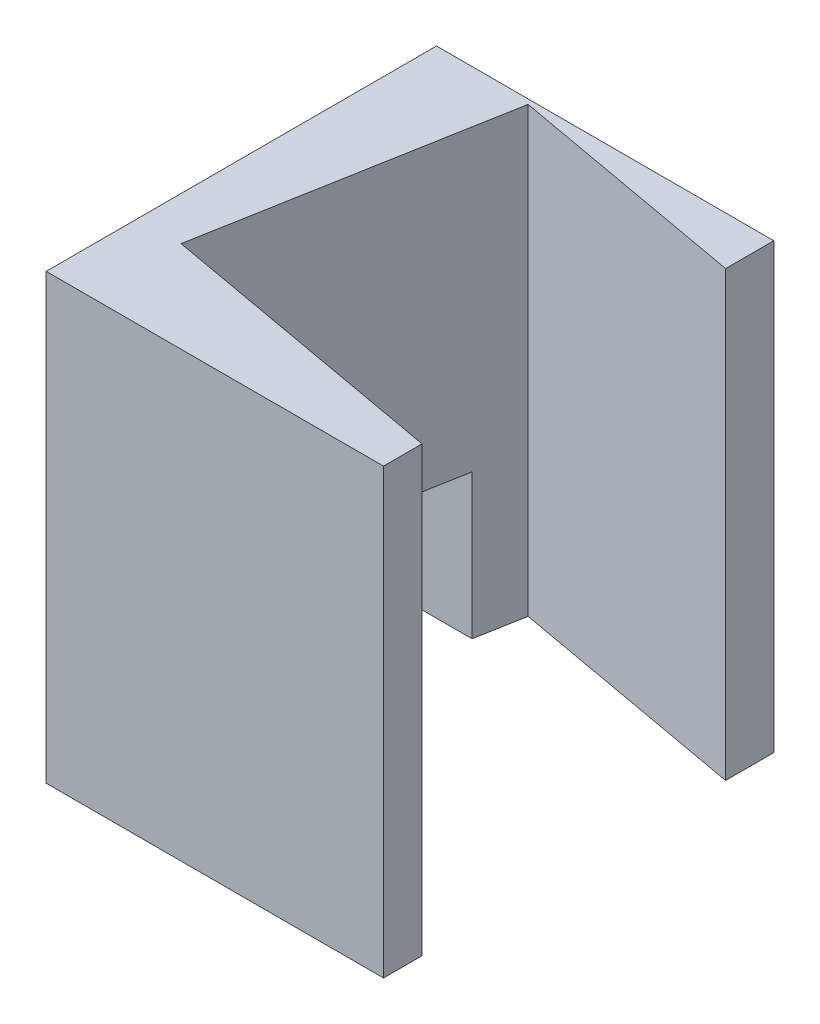
ISO-10303-21;
HEADER;
FILE_DESCRIPTION(('STEP AP214'),'2;1');
FILE_NAME('part.step','',(''),(''),'','','');
FILE_SCHEMA(('AUTOMOTIVE_DESIGN { 1 0 10303 214 1 1 1 1 }'));
ENDSEC;
DATA;
#1=APPLICATION_CONTEXT('core data for automotive mechanical design processes');
#2=APPLICATION_PROTOCOL_DEFINITION('international standard','automotive_design',2000,#1);
#3=PRODUCT_CONTEXT('',#1,'mechanical');
#4=PRODUCT('Part','Part','',(#3));
#5=PRODUCT_RELATED_PRODUCT_CATEGORY('part','',(#4));
#6=PRODUCT_DEFINITION_FORMATION('','',#4);
#7=PRODUCT_DEFINITION_CONTEXT('part definition',#1,'design');
#8=PRODUCT_DEFINITION('design','',#6,#7);
#9=PRODUCT_DEFINITION_SHAPE('','',#8);
#10=(LENGTH_UNIT() NAMED_UNIT(*) SI_UNIT(.MILLI.,.METRE.));
#11=(NAMED_UNIT(*) PLANE_ANGLE_UNIT() SI_UNIT($,.RADIAN.));
#12=(NAMED_UNIT(*) SI_UNIT($,.STERADIAN.) SOLID_ANGLE_UNIT());
#13=UNCERTAINTY_MEASURE_WITH_UNIT(LENGTH_MEASURE(1.E-05),#10,'distance_accuracy_value','');
#14=(GEOMETRIC_REPRESENTATION_CONTEXT(3) GLOBAL_UNCERTAINTY_ASSIGNED_CONTEXT((#13)) GLOBAL_UNIT_ASSIGNED_CONTEXT((#10,
#11,#12)) REPRESENTATION_CONTEXT('',''));
#15=CARTESIAN_POINT('',(0.,0.,0.));
#16=DIRECTION('',(0.,0.,1.));
#17=DIRECTION('',(1.,0.,0.));
#18=AXIS2_PLACEMENT_3D('',#15,#16,#17);
#19=CARTESIAN_POINT('',(0.,-18.4,0.));
#20=DIRECTION('',(0.984183323973695,0.,0.177152998315265));
#21=DIRECTION('',(0.177152998315265,0.,-0.984183323973695));
#22=AXIS2_PLACEMENT_3D('',#19,#20,#21);
#23=PLANE('',#22);
#24=DIRECTION('',(0.177152998315265,0.,-0.984183323973695));
#25=VECTOR('',#24,1.);
#26=CARTESIAN_POINT('',(0.,-18.4,0.));
#27=LINE('',#26,#25);
#28=CARTESIAN_POINT('',(-2.19669717910929,-18.4,12.2038732172738));
#29=VERTEX_POINT('',#28);
#30=CARTESIAN_POINT('',(-1.84239118247876,-18.4,10.2355065693264));
#31=VERTEX_POINT('',#30);
#32=EDGE_CURVE('E218',#29,#31,#27,.T.);
#33=ORIENTED_EDGE('',*,*,#32,.T.);
#34=DIRECTION('',(0.,-1.,0.));
#35=VECTOR('',#34,1.);
#36=CARTESIAN_POINT('',(-1.84239118247876,-18.4,10.2355065693264));
#37=LINE('',#36,#35);
#38=CARTESIAN_POINT('',(-1.84239118247876,-12.4,10.2355065693264));
#39=VERTEX_POINT('',#38);
#40=EDGE_CURVE('E268',#39,#31,#37,.T.);
#41=ORIENTED_EDGE('',*,*,#40,.F.);
#42=DIRECTION('',(-0.177152998315265,0.,0.984183323973695));
#43=VECTOR('',#42,1.);
#44=CARTESIAN_POINT('',(-1.84239118247876,-12.4,10.2355065693264));
#45=LINE('',#44,#43);
#46=CARTESIAN_POINT('',(-0.35430599663053,-12.4,1.96836664794739));
#47=VERTEX_POINT('',#46);
#48=EDGE_CURVE('E265',#47,#39,#45,.T.);
#49=ORIENTED_EDGE('',*,*,#48,.F.);
#50=DIRECTION('',(0.,1.,0.));
#51=VECTOR('',#50,1.);
#52=CARTESIAN_POINT('',(-0.354305996630529,-18.4,1.96836664794739));
#53=LINE('',#52,#51);
#54=CARTESIAN_POINT('',(-0.354305996630529,-18.4,1.96836664794739));
#55=VERTEX_POINT('',#54);
#56=EDGE_CURVE('E261',#55,#47,#53,.T.);
#57=ORIENTED_EDGE('',*,*,#56,.F.);
#58=CARTESIAN_POINT('',(0.,-18.4,0.));
#59=VERTEX_POINT('',#58);
#60=EDGE_CURVE('E115',#55,#59,#27,.T.);
#61=ORIENTED_EDGE('',*,*,#60,.T.);
#62=DIRECTION('',(0.,1.,0.));
#63=VECTOR('',#62,1.);
#64=CARTESIAN_POINT('',(0.,-18.4,0.));
#65=LINE('',#64,#63);
#66=CARTESIAN_POINT('',(0.,0.,0.));
#67=VERTEX_POINT('',#66);
#68=EDGE_CURVE('E172',#59,#67,#65,.T.);
#69=ORIENTED_EDGE('',*,*,#68,.T.);
#70=DIRECTION('',(0.177152998315265,0.,-0.984183323973695));
#71=VECTOR('',#70,1.);
#72=CARTESIAN_POINT('',(0.,0.,0.));
#73=LINE('',#72,#71);
#74=CARTESIAN_POINT('',(-2.19669717910929,0.,12.2038732172738));
#75=VERTEX_POINT('',#74);
#76=EDGE_CURVE('E173',#75,#67,#73,.T.);
#77=ORIENTED_EDGE('',*,*,#76,.F.);
#78=DIRECTION('',(0.,1.,0.));
#79=VECTOR('',#78,1.);
#80=CARTESIAN_POINT('',(-2.19669717910929,-18.4,12.2038732172738));
#81=LINE('',#80,#79);
#82=EDGE_CURVE('E12',#29,#75,#81,.T.);
#83=ORIENTED_EDGE('',*,*,#82,.F.);
#84=EDGE_LOOP('',(#33,#41,#49,#57,#61,#69,#77,#83));
#85=FACE_BOUND('',#84,.T.);
#86=ADVANCED_FACE('F53',(#85),#23,.T.);
#87=CARTESIAN_POINT('',(-4.,-18.4,-0.2));
#88=DIRECTION('',(-1.,0.,0.));
#89=DIRECTION('',(0.,0.,1.));
#90=AXIS2_PLACEMENT_3D('',#87,#88,#89);
#91=PLANE('',#90);
#92=DIRECTION('',(0.,0.,-1.));
#93=VECTOR('',#92,1.);
#94=CARTESIAN_POINT('',(-4.,-12.4,10.2355065693264));
#95=LINE('',#94,#93);
#96=CARTESIAN_POINT('',(-4.,-12.4,10.2355065693264));
#97=VERTEX_POINT('',#96);
#98=CARTESIAN_POINT('',(-4.,-12.4,1.96836664794739));
#99=VERTEX_POINT('',#98);
#100=EDGE_CURVE('E247',#97,#99,#95,.T.);
#101=ORIENTED_EDGE('',*,*,#100,.F.);
#102=DIRECTION('',(0.,1.,0.));
#103=VECTOR('',#102,1.);
#104=CARTESIAN_POINT('',(-4.,-18.4,10.2355065693264));
#105=LINE('',#104,#103);
#106=CARTESIAN_POINT('',(-4.,-18.4,10.2355065693264));
#107=VERTEX_POINT('',#106);
#108=EDGE_CURVE('E178',#107,#97,#105,.T.);
#109=ORIENTED_EDGE('',*,*,#108,.F.);
#110=DIRECTION('',(0.,0.,1.));
#111=VECTOR('',#110,1.);
#112=CARTESIAN_POINT('',(-4.,-18.4,-0.2));
#113=LINE('',#112,#111);
#114=CARTESIAN_POINT('',(-4.,-18.4,15.9992787095135));
#115=VERTEX_POINT('',#114);
#116=EDGE_CURVE('E164',#107,#115,#113,.T.);
#117=ORIENTED_EDGE('',*,*,#116,.T.);
#118=DIRECTION('',(0.,1.,0.));
#119=VECTOR('',#118,1.);
#120=CARTESIAN_POINT('',(-4.,-18.4,15.9992787095135));
#121=LINE('',#120,#119);
#122=CARTESIAN_POINT('',(-4.,0.,15.9992787095135));
#123=VERTEX_POINT('',#122);
#124=EDGE_CURVE('E146',#115,#123,#121,.T.);
#125=ORIENTED_EDGE('',*,*,#124,.T.);
#126=DIRECTION('',(0.,0.,1.));
#127=VECTOR('',#126,1.);
#128=CARTESIAN_POINT('',(-4.,0.,-0.2));
#129=LINE('',#128,#127);
#130=CARTESIAN_POINT('',(-4.,0.,-0.2));
#131=VERTEX_POINT('',#130);
#132=EDGE_CURVE('E190',#131,#123,#129,.T.);
#133=ORIENTED_EDGE('',*,*,#132,.F.);
#134=DIRECTION('',(0.,1.,0.));
#135=VECTOR('',#134,1.);
#136=CARTESIAN_POINT('',(-4.,-18.4,-0.2));
#137=LINE('',#136,#135);
#138=CARTESIAN_POINT('',(-4.,-18.4,-0.2));
#139=VERTEX_POINT('',#138);
#140=EDGE_CURVE('E207',#139,#131,#137,.T.);
#141=ORIENTED_EDGE('',*,*,#140,.F.);
#142=CARTESIAN_POINT('',(-4.,-18.4,1.96836664794739));
#143=VERTEX_POINT('',#142);
#144=EDGE_CURVE('E160',#139,#143,#113,.T.);
#145=ORIENTED_EDGE('',*,*,#144,.T.);
#146=DIRECTION('',(0.,-1.,0.));
#147=VECTOR('',#146,1.);
#148=CARTESIAN_POINT('',(-4.,-18.4,1.96836664794739));
#149=LINE('',#148,#147);
#150=EDGE_CURVE('E70',#99,#143,#149,.T.);
#151=ORIENTED_EDGE('',*,*,#150,.F.);
#152=EDGE_LOOP('',(#101,#109,#117,#125,#133,#141,#145,#151));
#153=FACE_BOUND('',#152,.T.);
#154=ADVANCED_FACE('F312',(#153),#91,.T.);
#155=CARTESIAN_POINT('',(0.,-18.4,0.));
#156=DIRECTION('',(0.,1.,0.));
#157=DIRECTION('',(0.,0.,1.));
#158=AXIS2_PLACEMENT_3D('',#155,#156,#157);
#159=PLANE('',#158);
#160=DIRECTION('',(-1.,0.,0.));
#161=VECTOR('',#160,1.);
#162=CARTESIAN_POINT('',(-1.84239118247876,-18.4,10.2355065693264));
#163=LINE('',#162,#161);
#164=EDGE_CURVE('E248',#31,#107,#163,.T.);
#165=ORIENTED_EDGE('',*,*,#164,.F.);
#166=ORIENTED_EDGE('',*,*,#32,.F.);
#167=DIRECTION('',(-0.984183323973695,0.,-0.177152998315265));
#168=VECTOR('',#167,1.);
#169=CARTESIAN_POINT('',(-2.19669717910929,-18.4,12.2038732172738));
#170=LINE('',#169,#168);
#171=CARTESIAN_POINT('',(10.,-18.4,14.3992787095135));
#172=VERTEX_POINT('',#171);
#173=EDGE_CURVE('E154',#172,#29,#170,.T.);
#174=ORIENTED_EDGE('',*,*,#173,.F.);
#175=DIRECTION('',(0.,0.,-1.));
#176=VECTOR('',#175,1.);
#177=CARTESIAN_POINT('',(10.,-18.4,14.3992787095135));
#178=LINE('',#177,#176);
#179=CARTESIAN_POINT('',(10.,-18.4,15.9992787095135));
#180=VERTEX_POINT('',#179);
#181=EDGE_CURVE('E137',#180,#172,#178,.T.);
#182=ORIENTED_EDGE('',*,*,#181,.F.);
#183=DIRECTION('',(1.,0.,0.));
#184=VECTOR('',#183,1.);
#185=CARTESIAN_POINT('',(10.,-18.4,15.9992787095135));
#186=LINE('',#185,#184);
#187=EDGE_CURVE('E153',#115,#180,#186,.T.);
#188=ORIENTED_EDGE('',*,*,#187,.F.);
#189=ORIENTED_EDGE('',*,*,#116,.F.);
#190=EDGE_LOOP('',(#165,#166,#174,#182,#188,#189));
#191=FACE_BOUND('',#190,.T.);
#192=ADVANCED_FACE('F151',(#191),#159,.F.);
#193=DIRECTION('',(-1.,0.,0.));
#194=VECTOR('',#193,1.);
#195=CARTESIAN_POINT('',(-0.354305996630529,-18.4,1.96836664794739));
#196=LINE('',#195,#194);
#197=EDGE_CURVE('E295',#55,#143,#196,.T.);
#198=ORIENTED_EDGE('',*,*,#197,.T.);
#199=ORIENTED_EDGE('',*,*,#144,.F.);
#200=DIRECTION('',(-1.,0.,0.));
#201=VECTOR('',#200,1.);
#202=CARTESIAN_POINT('',(10.,-18.4,-0.2));
#203=LINE('',#202,#201);
#204=CARTESIAN_POINT('',(10.,-18.4,-0.2));
#205=VERTEX_POINT('',#204);
#206=EDGE_CURVE('E235',#205,#139,#203,.T.);
#207=ORIENTED_EDGE('',*,*,#206,.F.);
#208=DIRECTION('',(0.,0.,-1.));
#209=VECTOR('',#208,1.);
#210=CARTESIAN_POINT('',(10.,-18.4,1.8));
#211=LINE('',#210,#209);
#212=CARTESIAN_POINT('',(10.,-18.4,1.8));
#213=VERTEX_POINT('',#212);
#214=EDGE_CURVE('E232',#213,#205,#211,.T.);
#215=ORIENTED_EDGE('',*,*,#214,.F.);
#216=DIRECTION('',(0.984183323973695,0.,0.177152998315265));
#217=VECTOR('',#216,1.);
#218=CARTESIAN_POINT('',(0.,-18.4,0.));
#219=LINE('',#218,#217);
#220=EDGE_CURVE('E222',#59,#213,#219,.T.);
#221=ORIENTED_EDGE('',*,*,#220,.F.);
#222=ORIENTED_EDGE('',*,*,#60,.F.);
#223=EDGE_LOOP('',(#198,#199,#207,#215,#221,#222));
#224=FACE_BOUND('',#223,.T.);
#225=ADVANCED_FACE('F316',(#224),#159,.F.);
#226=CARTESIAN_POINT('',(-2.19669717910929,-18.4,12.2038732172738));
#227=DIRECTION('',(0.177152998315265,0.,-0.984183323973695));
#228=DIRECTION('',(-0.984183323973695,0.,-0.177152998315265));
#229=AXIS2_PLACEMENT_3D('',#226,#227,#228);
#230=PLANE('',#229);
#231=DIRECTION('',(-0.984183323973695,0.,-0.177152998315265));
#232=VECTOR('',#231,1.);
#233=CARTESIAN_POINT('',(-2.19669717910929,0.,12.2038732172738));
#234=LINE('',#233,#232);
#235=CARTESIAN_POINT('',(10.,0.,14.3992787095135));
#236=VERTEX_POINT('',#235);
#237=EDGE_CURVE('E199',#236,#75,#234,.T.);
#238=ORIENTED_EDGE('',*,*,#237,.F.);
#239=DIRECTION('',(0.,1.,0.));
#240=VECTOR('',#239,1.);
#241=CARTESIAN_POINT('',(10.,-18.4,14.3992787095135));
#242=LINE('',#241,#240);
#243=EDGE_CURVE('E62',#172,#236,#242,.T.);
#244=ORIENTED_EDGE('',*,*,#243,.F.);
#245=ORIENTED_EDGE('',*,*,#173,.T.);
#246=ORIENTED_EDGE('',*,*,#82,.T.);
#247=EDGE_LOOP('',(#238,#244,#245,#246));
#248=FACE_BOUND('',#247,.T.);
#249=ADVANCED_FACE('F328',(#248),#230,.T.);
#250=CARTESIAN_POINT('',(10.,-18.4,14.3992787095135));
#251=DIRECTION('',(1.,0.,0.));
#252=DIRECTION('',(0.,0.,-1.));
#253=AXIS2_PLACEMENT_3D('',#250,#251,#252);
#254=PLANE('',#253);
#255=DIRECTION('',(0.,0.,-1.));
#256=VECTOR('',#255,1.);
#257=CARTESIAN_POINT('',(10.,0.,14.3992787095135));
#258=LINE('',#257,#256);
#259=CARTESIAN_POINT('',(10.,0.,15.9992787095135));
#260=VERTEX_POINT('',#259);
#261=EDGE_CURVE('E140',#260,#236,#258,.T.);
#262=ORIENTED_EDGE('',*,*,#261,.F.);
#263=DIRECTION('',(0.,1.,0.));
#264=VECTOR('',#263,1.);
#265=CARTESIAN_POINT('',(10.,-18.4,15.9992787095135));
#266=LINE('',#265,#264);
#267=EDGE_CURVE('E134',#180,#260,#266,.T.);
#268=ORIENTED_EDGE('',*,*,#267,.F.);
#269=ORIENTED_EDGE('',*,*,#181,.T.);
#270=ORIENTED_EDGE('',*,*,#243,.T.);
#271=EDGE_LOOP('',(#262,#268,#269,#270));
#272=FACE_BOUND('',#271,.T.);
#273=ADVANCED_FACE('F136',(#272),#254,.T.);
#274=CARTESIAN_POINT('',(10.,-18.4,15.9992787095135));
#275=DIRECTION('',(0.,0.,1.));
#276=DIRECTION('',(1.,0.,0.));
#277=AXIS2_PLACEMENT_3D('',#274,#275,#276);
#278=PLANE('',#277);
#279=DIRECTION('',(1.,0.,0.));
#280=VECTOR('',#279,1.);
#281=CARTESIAN_POINT('',(10.,0.,15.9992787095135));
#282=LINE('',#281,#280);
#283=EDGE_CURVE('E194',#123,#260,#282,.T.);
#284=ORIENTED_EDGE('',*,*,#283,.F.);
#285=ORIENTED_EDGE('',*,*,#124,.F.);
#286=ORIENTED_EDGE('',*,*,#187,.T.);
#287=ORIENTED_EDGE('',*,*,#267,.T.);
#288=EDGE_LOOP('',(#284,#285,#286,#287));
#289=FACE_BOUND('',#288,.T.);
#290=ADVANCED_FACE('F158',(#289),#278,.T.);
#291=CARTESIAN_POINT('',(10.,-18.4,-0.2));
#292=DIRECTION('',(0.,0.,-1.));
#293=DIRECTION('',(-1.,0.,0.));
#294=AXIS2_PLACEMENT_3D('',#291,#292,#293);
#295=PLANE('',#294);
#296=DIRECTION('',(-1.,0.,0.));
#297=VECTOR('',#296,1.);
#298=CARTESIAN_POINT('',(10.,0.,-0.2));
#299=LINE('',#298,#297);
#300=CARTESIAN_POINT('',(10.,0.,-0.2));
#301=VERTEX_POINT('',#300);
#302=EDGE_CURVE('E186',#301,#131,#299,.T.);
#303=ORIENTED_EDGE('',*,*,#302,.F.);
#304=DIRECTION('',(0.,1.,0.));
#305=VECTOR('',#304,1.);
#306=CARTESIAN_POINT('',(10.,-18.4,-0.2));
#307=LINE('',#306,#305);
#308=EDGE_CURVE('E210',#205,#301,#307,.T.);
#309=ORIENTED_EDGE('',*,*,#308,.F.);
#310=ORIENTED_EDGE('',*,*,#206,.T.);
#311=ORIENTED_EDGE('',*,*,#140,.T.);
#312=EDGE_LOOP('',(#303,#309,#310,#311));
#313=FACE_BOUND('',#312,.T.);
#314=ADVANCED_FACE('F349',(#313),#295,.T.);
#315=CARTESIAN_POINT('',(10.,-18.4,1.8));
#316=DIRECTION('',(1.,0.,0.));
#317=DIRECTION('',(0.,0.,-1.));
#318=AXIS2_PLACEMENT_3D('',#315,#316,#317);
#319=PLANE('',#318);
#320=DIRECTION('',(0.,0.,-1.));
#321=VECTOR('',#320,1.);
#322=CARTESIAN_POINT('',(10.,0.,1.8));
#323=LINE('',#322,#321);
#324=CARTESIAN_POINT('',(10.,0.,1.8));
#325=VERTEX_POINT('',#324);
#326=EDGE_CURVE('E182',#325,#301,#323,.T.);
#327=ORIENTED_EDGE('',*,*,#326,.F.);
#328=DIRECTION('',(0.,1.,0.));
#329=VECTOR('',#328,1.);
#330=CARTESIAN_POINT('',(10.,-18.4,1.8));
#331=LINE('',#330,#329);
#332=EDGE_CURVE('E213',#213,#325,#331,.T.);
#333=ORIENTED_EDGE('',*,*,#332,.F.);
#334=ORIENTED_EDGE('',*,*,#214,.T.);
#335=ORIENTED_EDGE('',*,*,#308,.T.);
#336=EDGE_LOOP('',(#327,#333,#334,#335));
#337=FACE_BOUND('',#336,.T.);
#338=ADVANCED_FACE('F352',(#337),#319,.T.);
#339=CARTESIAN_POINT('',(0.,-18.4,0.));
#340=DIRECTION('',(-0.177152998315265,0.,0.984183323973695));
#341=DIRECTION('',(0.984183323973695,0.,0.177152998315265));
#342=AXIS2_PLACEMENT_3D('',#339,#340,#341);
#343=PLANE('',#342);
#344=DIRECTION('',(0.984183323973695,0.,0.177152998315265));
#345=VECTOR('',#344,1.);
#346=CARTESIAN_POINT('',(0.,0.,0.));
#347=LINE('',#346,#345);
#348=EDGE_CURVE('E177',#67,#325,#347,.T.);
#349=ORIENTED_EDGE('',*,*,#348,.F.);
#350=ORIENTED_EDGE('',*,*,#68,.F.);
#351=ORIENTED_EDGE('',*,*,#220,.T.);
#352=ORIENTED_EDGE('',*,*,#332,.T.);
#353=EDGE_LOOP('',(#349,#350,#351,#352));
#354=FACE_BOUND('',#353,.T.);
#355=ADVANCED_FACE('F324',(#354),#343,.T.);
#356=CARTESIAN_POINT('',(0.,0.,0.));
#357=DIRECTION('',(0.,1.,0.));
#358=DIRECTION('',(0.,0.,1.));
#359=AXIS2_PLACEMENT_3D('',#356,#357,#358);
#360=PLANE('',#359);
#361=ORIENTED_EDGE('',*,*,#76,.T.);
#362=ORIENTED_EDGE('',*,*,#348,.T.);
#363=ORIENTED_EDGE('',*,*,#326,.T.);
#364=ORIENTED_EDGE('',*,*,#302,.T.);
#365=ORIENTED_EDGE('',*,*,#132,.T.);
#366=ORIENTED_EDGE('',*,*,#283,.T.);
#367=ORIENTED_EDGE('',*,*,#261,.T.);
#368=ORIENTED_EDGE('',*,*,#237,.T.);
#369=EDGE_LOOP('',(#361,#362,#363,#364,#365,#366,#367,#368));
#370=FACE_BOUND('',#369,.T.);
#371=ADVANCED_FACE('F327',(#370),#360,.T.);
#372=CARTESIAN_POINT('',(0.,-12.4,0.));
#373=DIRECTION('',(0.,-1.,0.));
#374=DIRECTION('',(0.,0.,-1.));
#375=AXIS2_PLACEMENT_3D('',#372,#373,#374);
#376=PLANE('',#375);
#377=DIRECTION('',(-1.,0.,0.));
#378=VECTOR('',#377,1.);
#379=CARTESIAN_POINT('',(-0.35430599663053,-12.4,1.96836664794739));
#380=LINE('',#379,#378);
#381=EDGE_CURVE('E272',#47,#99,#380,.T.);
#382=ORIENTED_EDGE('',*,*,#381,.F.);
#383=ORIENTED_EDGE('',*,*,#48,.T.);
#384=DIRECTION('',(-1.,0.,0.));
#385=VECTOR('',#384,1.);
#386=CARTESIAN_POINT('',(-1.84239118247876,-12.4,10.2355065693264));
#387=LINE('',#386,#385);
#388=EDGE_CURVE('E285',#39,#97,#387,.T.);
#389=ORIENTED_EDGE('',*,*,#388,.T.);
#390=ORIENTED_EDGE('',*,*,#100,.T.);
#391=EDGE_LOOP('',(#382,#383,#389,#390));
#392=FACE_BOUND('',#391,.T.);
#393=ADVANCED_FACE('F282',(#392),#376,.T.);
#394=CARTESIAN_POINT('',(0.,0.,10.2355065693264));
#395=DIRECTION('',(0.,0.,-1.));
#396=DIRECTION('',(-1.,0.,0.));
#397=AXIS2_PLACEMENT_3D('',#394,#395,#396);
#398=PLANE('',#397);
#399=ORIENTED_EDGE('',*,*,#388,.F.);
#400=ORIENTED_EDGE('',*,*,#40,.T.);
#401=ORIENTED_EDGE('',*,*,#164,.T.);
#402=ORIENTED_EDGE('',*,*,#108,.T.);
#403=EDGE_LOOP('',(#399,#400,#401,#402));
#404=FACE_BOUND('',#403,.T.);
#405=ADVANCED_FACE('F292',(#404),#398,.T.);
#406=CARTESIAN_POINT('',(0.,0.,1.9683666479474));
#407=DIRECTION('',(0.,0.,1.));
#408=DIRECTION('',(0.,-1.,0.));
#409=AXIS2_PLACEMENT_3D('',#406,#407,#408);
#410=PLANE('',#409);
#411=ORIENTED_EDGE('',*,*,#197,.F.);
#412=ORIENTED_EDGE('',*,*,#56,.T.);
#413=ORIENTED_EDGE('',*,*,#381,.T.);
#414=ORIENTED_EDGE('',*,*,#150,.T.);
#415=EDGE_LOOP('',(#411,#412,#413,#414));
#416=FACE_BOUND('',#415,.T.);
#417=ADVANCED_FACE('F309',(#416),#410,.T.);
#418=CLOSED_SHELL('',(#86,#154,#192,#225,#249,#273,#290,#314,#338,#355,#371,#393,#405,#417));
#419=MANIFOLD_SOLID_BREP('B2',#418);
#420=ADVANCED_BREP_SHAPE_REPRESENTATION('',(#18,#419),#14);
#421=SHAPE_DEFINITION_REPRESENTATION(#9,#420);
ENDSEC;
END-ISO-10303-21;
